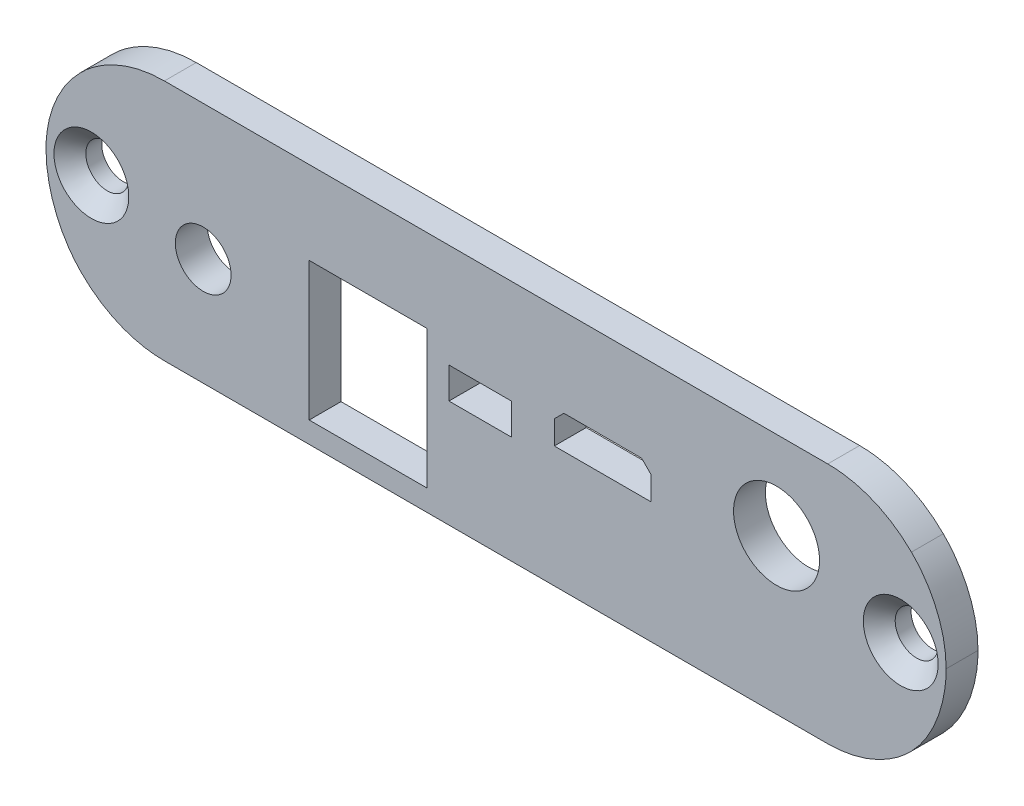
ISO-10303-21;
HEADER;
FILE_DESCRIPTION(('STEP AP214'),'2;1');
FILE_NAME('part.step','',(''),(''),'','','');
FILE_SCHEMA(('AUTOMOTIVE_DESIGN { 1 0 10303 214 1 1 1 1 }'));
ENDSEC;
DATA;
#1=APPLICATION_CONTEXT('core data for automotive mechanical design processes');
#2=APPLICATION_PROTOCOL_DEFINITION('international standard','automotive_design',2000,#1);
#3=PRODUCT_CONTEXT('',#1,'mechanical');
#4=PRODUCT('Part','Part','',(#3));
#5=PRODUCT_RELATED_PRODUCT_CATEGORY('part','',(#4));
#6=PRODUCT_DEFINITION_FORMATION('','',#4);
#7=PRODUCT_DEFINITION_CONTEXT('part definition',#1,'design');
#8=PRODUCT_DEFINITION('design','',#6,#7);
#9=PRODUCT_DEFINITION_SHAPE('','',#8);
#10=(LENGTH_UNIT() NAMED_UNIT(*) SI_UNIT(.MILLI.,.METRE.));
#11=(NAMED_UNIT(*) PLANE_ANGLE_UNIT() SI_UNIT($,.RADIAN.));
#12=(NAMED_UNIT(*) SI_UNIT($,.STERADIAN.) SOLID_ANGLE_UNIT());
#13=UNCERTAINTY_MEASURE_WITH_UNIT(LENGTH_MEASURE(1.E-05),#10,'distance_accuracy_value','');
#14=(GEOMETRIC_REPRESENTATION_CONTEXT(3) GLOBAL_UNCERTAINTY_ASSIGNED_CONTEXT((#13)) GLOBAL_UNIT_ASSIGNED_CONTEXT((#10,
#11,#12)) REPRESENTATION_CONTEXT('',''));
#15=CARTESIAN_POINT('',(0.,0.,0.));
#16=DIRECTION('',(0.,0.,1.));
#17=DIRECTION('',(1.,0.,0.));
#18=AXIS2_PLACEMENT_3D('',#15,#16,#17);
#19=CARTESIAN_POINT('',(15.1632625,-5.98045,2.54));
#20=DIRECTION('',(0.,0.,-1.));
#21=DIRECTION('',(-1.,0.,0.));
#22=AXIS2_PLACEMENT_3D('',#19,#20,#21);
#23=PLANE('',#22);
#24=CARTESIAN_POINT('',(12.2554,-2.1716,2.54));
#25=DIRECTION('',(0.,0.,-1.));
#26=DIRECTION('',(-1.,0.,0.));
#27=AXIS2_PLACEMENT_3D('',#24,#25,#26);
#28=CIRCLE('',#27,2.98440000000001);
#29=CARTESIAN_POINT('',(9.27099999999999,-2.1716,2.54));
#30=VERTEX_POINT('',#29);
#31=EDGE_CURVE('E41',#30,#30,#28,.T.);
#32=ORIENTED_EDGE('',*,*,#31,.T.);
#33=EDGE_LOOP('',(#32));
#34=FACE_BOUND('',#33,.T.);
#35=CARTESIAN_POINT('',(-52.2859,-2.1716,2.54));
#36=DIRECTION('',(0.,0.,-1.));
#37=DIRECTION('',(-1.,0.,0.));
#38=AXIS2_PLACEMENT_3D('',#35,#36,#37);
#39=CIRCLE('',#38,2.98440000000003);
#40=CARTESIAN_POINT('',(-55.2703,-2.1716,2.54));
#41=VERTEX_POINT('',#40);
#42=EDGE_CURVE('E484',#41,#41,#39,.T.);
#43=ORIENTED_EDGE('',*,*,#42,.T.);
#44=EDGE_LOOP('',(#43));
#45=FACE_BOUND('',#44,.T.);
#46=CARTESIAN_POINT('',(-43.3701,-3.5091,2.54));
#47=DIRECTION('',(0.,0.,1.));
#48=DIRECTION('',(1.,0.,0.));
#49=AXIS2_PLACEMENT_3D('',#46,#47,#48);
#50=CIRCLE('',#49,2.2226);
#51=CARTESIAN_POINT('',(-41.1475,-3.5091,2.54));
#52=VERTEX_POINT('',#51);
#53=EDGE_CURVE('E233',#52,#52,#50,.T.);
#54=ORIENTED_EDGE('',*,*,#53,.F.);
#55=EDGE_LOOP('',(#54));
#56=FACE_BOUND('',#55,.T.);
#57=CARTESIAN_POINT('',(2.35,0.250000000000001,2.54));
#58=DIRECTION('',(0.,0.,1.));
#59=DIRECTION('',(1.,0.,0.));
#60=AXIS2_PLACEMENT_3D('',#57,#58,#59);
#61=CIRCLE('',#60,3.4289);
#62=CARTESIAN_POINT('',(5.7789,0.250000000000001,2.54));
#63=VERTEX_POINT('',#62);
#64=EDGE_CURVE('E242',#63,#63,#61,.T.);
#65=ORIENTED_EDGE('',*,*,#64,.F.);
#66=EDGE_LOOP('',(#65));
#67=FACE_BOUND('',#66,.T.);
#68=DIRECTION('',(0.,-1.,0.));
#69=VECTOR('',#68,1.);
#70=CARTESIAN_POINT('',(-15.3715,-2.4124,2.54));
#71=LINE('',#70,#69);
#72=CARTESIAN_POINT('',(-15.3715,-0.5328,2.54));
#73=VERTEX_POINT('',#72);
#74=CARTESIAN_POINT('',(-15.3715,-2.4124,2.54));
#75=VERTEX_POINT('',#74);
#76=EDGE_CURVE('E248',#73,#75,#71,.T.);
#77=ORIENTED_EDGE('',*,*,#76,.F.);
#78=DIRECTION('',(-0.707106781186548,-0.707106781186547,0.));
#79=VECTOR('',#78,1.);
#80=CARTESIAN_POINT('',(-15.3715,-0.5328,2.54));
#81=LINE('',#80,#79);
#82=CARTESIAN_POINT('',(-14.6095,0.229199999999995,2.54));
#83=VERTEX_POINT('',#82);
#84=EDGE_CURVE('E260',#83,#73,#81,.T.);
#85=ORIENTED_EDGE('',*,*,#84,.F.);
#86=DIRECTION('',(-1.,0.,0.));
#87=VECTOR('',#86,1.);
#88=CARTESIAN_POINT('',(-14.6095,0.2292,2.54));
#89=LINE('',#88,#87);
#90=CARTESIAN_POINT('',(-8.4119,0.2292,2.54));
#91=VERTEX_POINT('',#90);
#92=EDGE_CURVE('E257',#91,#83,#89,.T.);
#93=ORIENTED_EDGE('',*,*,#92,.F.);
#94=DIRECTION('',(-0.707106781186548,0.707106781186547,0.));
#95=VECTOR('',#94,1.);
#96=CARTESIAN_POINT('',(-8.4119,0.2292,2.54));
#97=LINE('',#96,#95);
#98=CARTESIAN_POINT('',(-7.6499,-0.5328,2.54));
#99=VERTEX_POINT('',#98);
#100=EDGE_CURVE('E255',#99,#91,#97,.T.);
#101=ORIENTED_EDGE('',*,*,#100,.F.);
#102=DIRECTION('',(0.,1.,0.));
#103=VECTOR('',#102,1.);
#104=CARTESIAN_POINT('',(-7.6499,-2.4124,2.54));
#105=LINE('',#104,#103);
#106=CARTESIAN_POINT('',(-7.6499,-2.4124,2.54));
#107=VERTEX_POINT('',#106);
#108=EDGE_CURVE('E253',#107,#99,#105,.T.);
#109=ORIENTED_EDGE('',*,*,#108,.F.);
#110=DIRECTION('',(1.,0.,0.));
#111=VECTOR('',#110,1.);
#112=CARTESIAN_POINT('',(-15.3715,-2.4124,2.54));
#113=LINE('',#112,#111);
#114=EDGE_CURVE('E250',#75,#107,#113,.T.);
#115=ORIENTED_EDGE('',*,*,#114,.F.);
#116=EDGE_LOOP('',(#77,#85,#93,#101,#109,#115));
#117=FACE_BOUND('',#116,.T.);
#118=CARTESIAN_POINT('',(13.1151,-9.2429,2.54));
#119=CARTESIAN_POINT('',(14.8954,-7.4173,2.54));
#120=CARTESIAN_POINT('',(15.8766,-4.7239,2.54));
#121=CARTESIAN_POINT('',(15.875,-2.1771,2.54));
#122=B_SPLINE_CURVE_WITH_KNOTS('',3,(#118,#119,#120,#121),.UNSPECIFIED.,.F.,.F.,(4,4),(0.9,1.),.UNSPECIFIED.);
#123=CARTESIAN_POINT('',(13.1151,-9.2429,2.54));
#124=VERTEX_POINT('',#123);
#125=CARTESIAN_POINT('',(15.875,-2.1771,2.54));
#126=VERTEX_POINT('',#125);
#127=EDGE_CURVE('E324',#124,#126,#122,.T.);
#128=ORIENTED_EDGE('',*,*,#127,.T.);
#129=CARTESIAN_POINT('',(15.875,-2.1771,2.54));
#130=CARTESIAN_POINT('',(15.8735,0.322300000000001,2.54));
#131=CARTESIAN_POINT('',(14.8775,2.7305,2.54));
#132=CARTESIAN_POINT('',(13.1074,4.496,2.54));
#133=B_SPLINE_CURVE_WITH_KNOTS('',3,(#129,#130,#131,#132),.UNSPECIFIED.,.F.,.F.,(4,4),(0.,0.1),.UNSPECIFIED.);
#134=CARTESIAN_POINT('',(13.1074,4.496,2.54));
#135=VERTEX_POINT('',#134);
#136=EDGE_CURVE('E330',#126,#135,#133,.T.);
#137=ORIENTED_EDGE('',*,*,#136,.T.);
#138=CARTESIAN_POINT('',(13.1074,4.496,2.54));
#139=CARTESIAN_POINT('',(11.3364,6.2625,2.54));
#140=CARTESIAN_POINT('',(8.9354,7.2533,2.54));
#141=CARTESIAN_POINT('',(6.434,7.2517,2.54));
#142=B_SPLINE_CURVE_WITH_KNOTS('',3,(#138,#139,#140,#141),.UNSPECIFIED.,.F.,.F.,(4,4),(0.1,0.2),.UNSPECIFIED.);
#143=CARTESIAN_POINT('',(6.434,7.2517,2.54));
#144=VERTEX_POINT('',#143);
#145=EDGE_CURVE('E599',#135,#144,#142,.T.);
#146=ORIENTED_EDGE('',*,*,#145,.T.);
#147=DIRECTION('',(-1.,0.,0.));
#148=VECTOR('',#147,1.);
#149=CARTESIAN_POINT('',(6.434,7.2517,2.54));
#150=LINE('',#149,#148);
#151=CARTESIAN_POINT('',(-46.4644,7.2517,2.54));
#152=VERTEX_POINT('',#151);
#153=EDGE_CURVE('E600',#144,#152,#150,.T.);
#154=ORIENTED_EDGE('',*,*,#153,.T.);
#155=CARTESIAN_POINT('',(-46.4644,7.2517,2.54));
#156=CARTESIAN_POINT('',(-48.9654,7.2501,2.54));
#157=CARTESIAN_POINT('',(-51.3771,6.2567,2.54));
#158=CARTESIAN_POINT('',(-53.1462,4.4876,2.54));
#159=B_SPLINE_CURVE_WITH_KNOTS('',3,(#155,#156,#157,#158),.UNSPECIFIED.,.F.,.F.,(4,4),(0.3,0.4),.UNSPECIFIED.);
#160=CARTESIAN_POINT('',(-53.1462,4.4876,2.54));
#161=VERTEX_POINT('',#160);
#162=EDGE_CURVE('E602',#152,#161,#159,.T.);
#163=ORIENTED_EDGE('',*,*,#162,.T.);
#164=CARTESIAN_POINT('',(-53.1462,4.4876,2.54));
#165=CARTESIAN_POINT('',(-54.9139,2.7201,2.54));
#166=CARTESIAN_POINT('',(-55.907,0.322799999999999,2.54));
#167=CARTESIAN_POINT('',(-55.9054,-2.1769,2.54));
#168=B_SPLINE_CURVE_WITH_KNOTS('',3,(#164,#165,#166,#167),.UNSPECIFIED.,.F.,.F.,(4,4),(0.4,0.5),.UNSPECIFIED.);
#169=CARTESIAN_POINT('',(-55.9054,-2.1769,2.54));
#170=VERTEX_POINT('',#169);
#171=EDGE_CURVE('E629',#161,#170,#168,.T.);
#172=ORIENTED_EDGE('',*,*,#171,.T.);
#173=CARTESIAN_POINT('',(-55.9054,-2.1769,2.54));
#174=CARTESIAN_POINT('',(-55.9039,-4.7242,2.54));
#175=CARTESIAN_POINT('',(-54.9188,-7.4291,2.54));
#176=CARTESIAN_POINT('',(-53.137,-9.2518,2.54));
#177=B_SPLINE_CURVE_WITH_KNOTS('',3,(#173,#174,#175,#176),.UNSPECIFIED.,.F.,.F.,(4,4),(0.5,0.6),.UNSPECIFIED.);
#178=CARTESIAN_POINT('',(-53.137,-9.2518,2.54));
#179=VERTEX_POINT('',#178);
#180=EDGE_CURVE('E637',#170,#179,#177,.T.);
#181=ORIENTED_EDGE('',*,*,#180,.T.);
#182=CARTESIAN_POINT('',(-53.137,-9.2518,2.54));
#183=CARTESIAN_POINT('',(-51.3786,-11.0507,2.54));
#184=CARTESIAN_POINT('',(-48.9824,-12.0793,2.54));
#185=CARTESIAN_POINT('',(-46.4644,-12.0777,2.54));
#186=B_SPLINE_CURVE_WITH_KNOTS('',3,(#182,#183,#184,#185),.UNSPECIFIED.,.F.,.F.,(4,4),(0.6,0.7),.UNSPECIFIED.);
#187=CARTESIAN_POINT('',(-46.4644,-12.0777,2.54));
#188=VERTEX_POINT('',#187);
#189=EDGE_CURVE('E644',#179,#188,#186,.T.);
#190=ORIENTED_EDGE('',*,*,#189,.T.);
#191=DIRECTION('',(1.,0.,0.));
#192=VECTOR('',#191,1.);
#193=CARTESIAN_POINT('',(-46.4644,-12.0777,2.54));
#194=LINE('',#193,#192);
#195=CARTESIAN_POINT('',(6.434,-12.0777,2.54));
#196=VERTEX_POINT('',#195);
#197=EDGE_CURVE('E388',#188,#196,#194,.T.);
#198=ORIENTED_EDGE('',*,*,#197,.T.);
#199=CARTESIAN_POINT('',(6.434,-12.0777,2.54));
#200=CARTESIAN_POINT('',(8.9516,-12.0761,2.54));
#201=CARTESIAN_POINT('',(11.3581,-11.0449,2.54));
#202=CARTESIAN_POINT('',(13.1151,-9.2429,2.54));
#203=B_SPLINE_CURVE_WITH_KNOTS('',3,(#199,#200,#201,#202),.UNSPECIFIED.,.F.,.F.,(4,4),(0.8,0.9),.UNSPECIFIED.);
#204=EDGE_CURVE('E381',#196,#124,#203,.T.);
#205=ORIENTED_EDGE('',*,*,#204,.T.);
#206=EDGE_LOOP('',(#128,#137,#146,#154,#163,#172,#181,#190,#198,#205));
#207=FACE_BOUND('',#206,.T.);
#208=DIRECTION('',(0.,1.,0.));
#209=VECTOR('',#208,1.);
#210=CARTESIAN_POINT('',(-25.5201,0.631000000000001,2.54));
#211=LINE('',#210,#209);
#212=CARTESIAN_POINT('',(-25.5201,-10.3925,2.54));
#213=VERTEX_POINT('',#212);
#214=CARTESIAN_POINT('',(-25.5201,0.631000000000001,2.54));
#215=VERTEX_POINT('',#214);
#216=EDGE_CURVE('E293',#213,#215,#211,.T.);
#217=ORIENTED_EDGE('',*,*,#216,.F.);
#218=DIRECTION('',(1.,0.,0.));
#219=VECTOR('',#218,1.);
#220=CARTESIAN_POINT('',(-34.9181,-10.3925,2.54));
#221=LINE('',#220,#219);
#222=CARTESIAN_POINT('',(-34.9181,-10.3925,2.54));
#223=VERTEX_POINT('',#222);
#224=EDGE_CURVE('E301',#223,#213,#221,.T.);
#225=ORIENTED_EDGE('',*,*,#224,.F.);
#226=DIRECTION('',(0.,-1.,0.));
#227=VECTOR('',#226,1.);
#228=CARTESIAN_POINT('',(-34.9181,0.631000000000001,2.54));
#229=LINE('',#228,#227);
#230=CARTESIAN_POINT('',(-34.9181,0.631000000000001,2.54));
#231=VERTEX_POINT('',#230);
#232=EDGE_CURVE('E298',#231,#223,#229,.T.);
#233=ORIENTED_EDGE('',*,*,#232,.F.);
#234=DIRECTION('',(-1.,0.,0.));
#235=VECTOR('',#234,1.);
#236=CARTESIAN_POINT('',(-34.9181,0.631000000000001,2.54));
#237=LINE('',#236,#235);
#238=EDGE_CURVE('E295',#215,#231,#237,.T.);
#239=ORIENTED_EDGE('',*,*,#238,.F.);
#240=EDGE_LOOP('',(#217,#225,#233,#239));
#241=FACE_BOUND('',#240,.T.);
#242=DIRECTION('',(0.,1.,0.));
#243=VECTOR('',#242,1.);
#244=CARTESIAN_POINT('',(-18.7701,-1.0201,2.54));
#245=LINE('',#244,#243);
#246=CARTESIAN_POINT('',(-18.7701,-3.5092,2.54));
#247=VERTEX_POINT('',#246);
#248=CARTESIAN_POINT('',(-18.7701,-1.0201,2.54));
#249=VERTEX_POINT('',#248);
#250=EDGE_CURVE('E194',#247,#249,#245,.T.);
#251=ORIENTED_EDGE('',*,*,#250,.F.);
#252=DIRECTION('',(1.,0.,0.));
#253=VECTOR('',#252,1.);
#254=CARTESIAN_POINT('',(-23.7738,-3.5092,2.54));
#255=LINE('',#254,#253);
#256=CARTESIAN_POINT('',(-23.7738,-3.5092,2.54));
#257=VERTEX_POINT('',#256);
#258=EDGE_CURVE('E216',#257,#247,#255,.T.);
#259=ORIENTED_EDGE('',*,*,#258,.F.);
#260=DIRECTION('',(0.,-1.,0.));
#261=VECTOR('',#260,1.);
#262=CARTESIAN_POINT('',(-23.7738,-1.0201,2.54));
#263=LINE('',#262,#261);
#264=CARTESIAN_POINT('',(-23.7738,-1.0201,2.54));
#265=VERTEX_POINT('',#264);
#266=EDGE_CURVE('E214',#265,#257,#263,.T.);
#267=ORIENTED_EDGE('',*,*,#266,.F.);
#268=DIRECTION('',(-1.,0.,0.));
#269=VECTOR('',#268,1.);
#270=CARTESIAN_POINT('',(-23.7738,-1.0201,2.54));
#271=LINE('',#270,#269);
#272=EDGE_CURVE('E202',#249,#265,#271,.T.);
#273=ORIENTED_EDGE('',*,*,#272,.F.);
#274=EDGE_LOOP('',(#251,#259,#267,#273));
#275=FACE_BOUND('',#274,.T.);
#276=ADVANCED_FACE('F33',(#34,#45,#56,#67,#117,#207,#241,#275),#23,.F.);
#277=CARTESIAN_POINT('',(15.1632625,-5.98045,0.));
#278=DIRECTION('',(0.,0.,-1.));
#279=DIRECTION('',(-1.,0.,0.));
#280=AXIS2_PLACEMENT_3D('',#277,#278,#279);
#281=PLANE('',#280);
#282=CARTESIAN_POINT('',(-43.3701,-3.5091,0.));
#283=DIRECTION('',(0.,0.,1.));
#284=DIRECTION('',(1.,0.,0.));
#285=AXIS2_PLACEMENT_3D('',#282,#283,#284);
#286=CIRCLE('',#285,2.2226);
#287=CARTESIAN_POINT('',(-41.1475,-3.5091,0.));
#288=VERTEX_POINT('',#287);
#289=EDGE_CURVE('E232',#288,#288,#286,.T.);
#290=ORIENTED_EDGE('',*,*,#289,.T.);
#291=EDGE_LOOP('',(#290));
#292=FACE_BOUND('',#291,.T.);
#293=CARTESIAN_POINT('',(2.35,0.250000000000001,0.));
#294=DIRECTION('',(0.,0.,1.));
#295=DIRECTION('',(1.,0.,0.));
#296=AXIS2_PLACEMENT_3D('',#293,#294,#295);
#297=CIRCLE('',#296,3.4289);
#298=CARTESIAN_POINT('',(5.7789,0.250000000000001,0.));
#299=VERTEX_POINT('',#298);
#300=EDGE_CURVE('E241',#299,#299,#297,.T.);
#301=ORIENTED_EDGE('',*,*,#300,.T.);
#302=EDGE_LOOP('',(#301));
#303=FACE_BOUND('',#302,.T.);
#304=CARTESIAN_POINT('',(13.1151,-9.2429,0.));
#305=CARTESIAN_POINT('',(14.8954,-7.4173,0.));
#306=CARTESIAN_POINT('',(15.8766,-4.7239,0.));
#307=CARTESIAN_POINT('',(15.875,-2.1771,0.));
#308=B_SPLINE_CURVE_WITH_KNOTS('',3,(#304,#305,#306,#307),.UNSPECIFIED.,.F.,.F.,(4,4),(0.9,1.),.UNSPECIFIED.);
#309=CARTESIAN_POINT('',(13.1151,-9.2429,0.));
#310=VERTEX_POINT('',#309);
#311=CARTESIAN_POINT('',(15.875,-2.1771,0.));
#312=VERTEX_POINT('',#311);
#313=EDGE_CURVE('E323',#310,#312,#308,.T.);
#314=ORIENTED_EDGE('',*,*,#313,.F.);
#315=CARTESIAN_POINT('',(6.434,-12.0777,0.));
#316=CARTESIAN_POINT('',(8.9516,-12.0761,0.));
#317=CARTESIAN_POINT('',(11.3581,-11.0449,0.));
#318=CARTESIAN_POINT('',(13.1151,-9.2429,0.));
#319=B_SPLINE_CURVE_WITH_KNOTS('',3,(#315,#316,#317,#318),.UNSPECIFIED.,.F.,.F.,(4,4),(0.8,0.9),.UNSPECIFIED.);
#320=CARTESIAN_POINT('',(6.434,-12.0777,0.));
#321=VERTEX_POINT('',#320);
#322=EDGE_CURVE('E331',#321,#310,#319,.T.);
#323=ORIENTED_EDGE('',*,*,#322,.F.);
#324=DIRECTION('',(1.,0.,0.));
#325=VECTOR('',#324,1.);
#326=CARTESIAN_POINT('',(-46.4644,-12.0777,0.));
#327=LINE('',#326,#325);
#328=CARTESIAN_POINT('',(-46.4644,-12.0777,0.));
#329=VERTEX_POINT('',#328);
#330=EDGE_CURVE('E441',#329,#321,#327,.T.);
#331=ORIENTED_EDGE('',*,*,#330,.F.);
#332=CARTESIAN_POINT('',(-53.137,-9.2518,0.));
#333=CARTESIAN_POINT('',(-51.3786,-11.0507,0.));
#334=CARTESIAN_POINT('',(-48.9824,-12.0793,0.));
#335=CARTESIAN_POINT('',(-46.4644,-12.0777,0.));
#336=B_SPLINE_CURVE_WITH_KNOTS('',3,(#332,#333,#334,#335),.UNSPECIFIED.,.F.,.F.,(4,4),(0.6,0.7),.UNSPECIFIED.);
#337=CARTESIAN_POINT('',(-53.137,-9.2518,0.));
#338=VERTEX_POINT('',#337);
#339=EDGE_CURVE('E434',#338,#329,#336,.T.);
#340=ORIENTED_EDGE('',*,*,#339,.F.);
#341=CARTESIAN_POINT('',(-55.9054,-2.1769,0.));
#342=CARTESIAN_POINT('',(-55.9039,-4.7242,0.));
#343=CARTESIAN_POINT('',(-54.9188,-7.4291,0.));
#344=CARTESIAN_POINT('',(-53.137,-9.2518,0.));
#345=B_SPLINE_CURVE_WITH_KNOTS('',3,(#341,#342,#343,#344),.UNSPECIFIED.,.F.,.F.,(4,4),(0.5,0.6),.UNSPECIFIED.);
#346=CARTESIAN_POINT('',(-55.9054,-2.1769,0.));
#347=VERTEX_POINT('',#346);
#348=EDGE_CURVE('E427',#347,#338,#345,.T.);
#349=ORIENTED_EDGE('',*,*,#348,.F.);
#350=CARTESIAN_POINT('',(-53.1462,4.4876,0.));
#351=CARTESIAN_POINT('',(-54.9139,2.7201,0.));
#352=CARTESIAN_POINT('',(-55.907,0.322799999999999,0.));
#353=CARTESIAN_POINT('',(-55.9054,-2.1769,0.));
#354=B_SPLINE_CURVE_WITH_KNOTS('',3,(#350,#351,#352,#353),.UNSPECIFIED.,.F.,.F.,(4,4),(0.4,0.5),.UNSPECIFIED.);
#355=CARTESIAN_POINT('',(-53.1462,4.4876,0.));
#356=VERTEX_POINT('',#355);
#357=EDGE_CURVE('E420',#356,#347,#354,.T.);
#358=ORIENTED_EDGE('',*,*,#357,.F.);
#359=CARTESIAN_POINT('',(-46.4644,7.2517,0.));
#360=CARTESIAN_POINT('',(-48.9654,7.2501,0.));
#361=CARTESIAN_POINT('',(-51.3771,6.2567,0.));
#362=CARTESIAN_POINT('',(-53.1462,4.4876,0.));
#363=B_SPLINE_CURVE_WITH_KNOTS('',3,(#359,#360,#361,#362),.UNSPECIFIED.,.F.,.F.,(4,4),(0.3,0.4),.UNSPECIFIED.);
#364=CARTESIAN_POINT('',(-46.4644,7.2517,0.));
#365=VERTEX_POINT('',#364);
#366=EDGE_CURVE('E416',#365,#356,#363,.T.);
#367=ORIENTED_EDGE('',*,*,#366,.F.);
#368=DIRECTION('',(-1.,0.,0.));
#369=VECTOR('',#368,1.);
#370=CARTESIAN_POINT('',(6.434,7.2517,0.));
#371=LINE('',#370,#369);
#372=CARTESIAN_POINT('',(6.434,7.2517,0.));
#373=VERTEX_POINT('',#372);
#374=EDGE_CURVE('E411',#373,#365,#371,.T.);
#375=ORIENTED_EDGE('',*,*,#374,.F.);
#376=CARTESIAN_POINT('',(13.1074,4.496,0.));
#377=CARTESIAN_POINT('',(11.3364,6.2625,0.));
#378=CARTESIAN_POINT('',(8.9354,7.2533,0.));
#379=CARTESIAN_POINT('',(6.434,7.2517,0.));
#380=B_SPLINE_CURVE_WITH_KNOTS('',3,(#376,#377,#378,#379),.UNSPECIFIED.,.F.,.F.,(4,4),(0.1,0.2),.UNSPECIFIED.);
#381=CARTESIAN_POINT('',(13.1074,4.496,0.));
#382=VERTEX_POINT('',#381);
#383=EDGE_CURVE('E404',#382,#373,#380,.T.);
#384=ORIENTED_EDGE('',*,*,#383,.F.);
#385=CARTESIAN_POINT('',(15.875,-2.1771,0.));
#386=CARTESIAN_POINT('',(15.8735,0.322300000000001,0.));
#387=CARTESIAN_POINT('',(14.8775,2.7305,0.));
#388=CARTESIAN_POINT('',(13.1074,4.496,0.));
#389=B_SPLINE_CURVE_WITH_KNOTS('',3,(#385,#386,#387,#388),.UNSPECIFIED.,.F.,.F.,(4,4),(0.,0.1),.UNSPECIFIED.);
#390=EDGE_CURVE('E397',#312,#382,#389,.T.);
#391=ORIENTED_EDGE('',*,*,#390,.F.);
#392=EDGE_LOOP('',(#314,#323,#331,#340,#349,#358,#367,#375,#384,#391));
#393=FACE_BOUND('',#392,.T.);
#394=DIRECTION('',(1.,0.,0.));
#395=VECTOR('',#394,1.);
#396=CARTESIAN_POINT('',(-34.9181,-10.3925,0.));
#397=LINE('',#396,#395);
#398=CARTESIAN_POINT('',(-34.9181,-10.3925,0.));
#399=VERTEX_POINT('',#398);
#400=CARTESIAN_POINT('',(-25.5201,-10.3925,0.));
#401=VERTEX_POINT('',#400);
#402=EDGE_CURVE('E296',#399,#401,#397,.T.);
#403=ORIENTED_EDGE('',*,*,#402,.T.);
#404=DIRECTION('',(0.,1.,0.));
#405=VECTOR('',#404,1.);
#406=CARTESIAN_POINT('',(-25.5201,0.631000000000001,0.));
#407=LINE('',#406,#405);
#408=CARTESIAN_POINT('',(-25.5201,0.631000000000001,0.));
#409=VERTEX_POINT('',#408);
#410=EDGE_CURVE('E292',#401,#409,#407,.T.);
#411=ORIENTED_EDGE('',*,*,#410,.T.);
#412=DIRECTION('',(-1.,0.,0.));
#413=VECTOR('',#412,1.);
#414=CARTESIAN_POINT('',(-34.9181,0.631000000000001,0.));
#415=LINE('',#414,#413);
#416=CARTESIAN_POINT('',(-34.9181,0.631000000000001,0.));
#417=VERTEX_POINT('',#416);
#418=EDGE_CURVE('E306',#409,#417,#415,.T.);
#419=ORIENTED_EDGE('',*,*,#418,.T.);
#420=DIRECTION('',(0.,-1.,0.));
#421=VECTOR('',#420,1.);
#422=CARTESIAN_POINT('',(-34.9181,0.631000000000001,0.));
#423=LINE('',#422,#421);
#424=EDGE_CURVE('E309',#417,#399,#423,.T.);
#425=ORIENTED_EDGE('',*,*,#424,.T.);
#426=EDGE_LOOP('',(#403,#411,#419,#425));
#427=FACE_BOUND('',#426,.T.);
#428=DIRECTION('',(-0.707106781186548,-0.707106781186547,0.));
#429=VECTOR('',#428,1.);
#430=CARTESIAN_POINT('',(-15.3715,-0.5328,0.));
#431=LINE('',#430,#429);
#432=CARTESIAN_POINT('',(-14.6095,0.2292,0.));
#433=VERTEX_POINT('',#432);
#434=CARTESIAN_POINT('',(-15.3715,-0.5328,0.));
#435=VERTEX_POINT('',#434);
#436=EDGE_CURVE('E251',#433,#435,#431,.T.);
#437=ORIENTED_EDGE('',*,*,#436,.T.);
#438=DIRECTION('',(0.,-1.,0.));
#439=VECTOR('',#438,1.);
#440=CARTESIAN_POINT('',(-15.3715,-2.4124,0.));
#441=LINE('',#440,#439);
#442=CARTESIAN_POINT('',(-15.3715,-2.4124,0.));
#443=VERTEX_POINT('',#442);
#444=EDGE_CURVE('E245',#435,#443,#441,.T.);
#445=ORIENTED_EDGE('',*,*,#444,.T.);
#446=DIRECTION('',(1.,0.,0.));
#447=VECTOR('',#446,1.);
#448=CARTESIAN_POINT('',(-15.3715,-2.4124,0.));
#449=LINE('',#448,#447);
#450=CARTESIAN_POINT('',(-7.6499,-2.4124,0.));
#451=VERTEX_POINT('',#450);
#452=EDGE_CURVE('E265',#443,#451,#449,.T.);
#453=ORIENTED_EDGE('',*,*,#452,.T.);
#454=DIRECTION('',(0.,1.,0.));
#455=VECTOR('',#454,1.);
#456=CARTESIAN_POINT('',(-7.6499,-2.4124,0.));
#457=LINE('',#456,#455);
#458=CARTESIAN_POINT('',(-7.6499,-0.5328,0.));
#459=VERTEX_POINT('',#458);
#460=EDGE_CURVE('E268',#451,#459,#457,.T.);
#461=ORIENTED_EDGE('',*,*,#460,.T.);
#462=DIRECTION('',(-0.707106781186548,0.707106781186547,0.));
#463=VECTOR('',#462,1.);
#464=CARTESIAN_POINT('',(-8.4119,0.2292,0.));
#465=LINE('',#464,#463);
#466=CARTESIAN_POINT('',(-8.4119,0.2292,0.));
#467=VERTEX_POINT('',#466);
#468=EDGE_CURVE('E271',#459,#467,#465,.T.);
#469=ORIENTED_EDGE('',*,*,#468,.T.);
#470=DIRECTION('',(-1.,0.,0.));
#471=VECTOR('',#470,1.);
#472=CARTESIAN_POINT('',(-14.6095,0.2292,0.));
#473=LINE('',#472,#471);
#474=EDGE_CURVE('E274',#467,#433,#473,.T.);
#475=ORIENTED_EDGE('',*,*,#474,.T.);
#476=EDGE_LOOP('',(#437,#445,#453,#461,#469,#475));
#477=FACE_BOUND('',#476,.T.);
#478=CARTESIAN_POINT('',(12.2554,-2.1716,0.));
#479=DIRECTION('',(0.,0.,1.));
#480=DIRECTION('',(1.,0.,0.));
#481=AXIS2_PLACEMENT_3D('',#478,#479,#480);
#482=CIRCLE('',#481,1.7144);
#483=CARTESIAN_POINT('',(13.9698,-2.1716,0.));
#484=VERTEX_POINT('',#483);
#485=EDGE_CURVE('E236',#484,#484,#482,.T.);
#486=ORIENTED_EDGE('',*,*,#485,.T.);
#487=EDGE_LOOP('',(#486));
#488=FACE_BOUND('',#487,.T.);
#489=CARTESIAN_POINT('',(-52.2859,-2.1716,0.));
#490=DIRECTION('',(0.,0.,1.));
#491=DIRECTION('',(1.,0.,0.));
#492=AXIS2_PLACEMENT_3D('',#489,#490,#491);
#493=CIRCLE('',#492,1.7144);
#494=CARTESIAN_POINT('',(-50.5715,-2.1716,0.));
#495=VERTEX_POINT('',#494);
#496=EDGE_CURVE('E210',#495,#495,#493,.T.);
#497=ORIENTED_EDGE('',*,*,#496,.T.);
#498=EDGE_LOOP('',(#497));
#499=FACE_BOUND('',#498,.T.);
#500=DIRECTION('',(1.,0.,0.));
#501=VECTOR('',#500,1.);
#502=CARTESIAN_POINT('',(-23.7738,-3.5092,0.));
#503=LINE('',#502,#501);
#504=CARTESIAN_POINT('',(-23.7738,-3.5092,0.));
#505=VERTEX_POINT('',#504);
#506=CARTESIAN_POINT('',(-18.7701,-3.5092,0.));
#507=VERTEX_POINT('',#506);
#508=EDGE_CURVE('E203',#505,#507,#503,.T.);
#509=ORIENTED_EDGE('',*,*,#508,.T.);
#510=DIRECTION('',(0.,1.,0.));
#511=VECTOR('',#510,1.);
#512=CARTESIAN_POINT('',(-18.7701,-1.0201,0.));
#513=LINE('',#512,#511);
#514=CARTESIAN_POINT('',(-18.7701,-1.0201,0.));
#515=VERTEX_POINT('',#514);
#516=EDGE_CURVE('E56',#507,#515,#513,.T.);
#517=ORIENTED_EDGE('',*,*,#516,.T.);
#518=DIRECTION('',(-1.,0.,0.));
#519=VECTOR('',#518,1.);
#520=CARTESIAN_POINT('',(-23.7738,-1.0201,0.));
#521=LINE('',#520,#519);
#522=CARTESIAN_POINT('',(-23.7738,-1.0201,0.));
#523=VERTEX_POINT('',#522);
#524=EDGE_CURVE('E209',#515,#523,#521,.T.);
#525=ORIENTED_EDGE('',*,*,#524,.T.);
#526=DIRECTION('',(0.,-1.,0.));
#527=VECTOR('',#526,1.);
#528=CARTESIAN_POINT('',(-23.7738,-1.0201,0.));
#529=LINE('',#528,#527);
#530=EDGE_CURVE('E222',#523,#505,#529,.T.);
#531=ORIENTED_EDGE('',*,*,#530,.T.);
#532=EDGE_LOOP('',(#509,#517,#525,#531));
#533=FACE_BOUND('',#532,.T.);
#534=ADVANCED_FACE('F344',(#292,#303,#393,#427,#477,#488,#499,#533),#281,.T.);
#535=DIRECTION('',(0.,0.,-1.));
#536=VECTOR('',#535,1.);
#537=SURFACE_OF_LINEAR_EXTRUSION('',#122,#536);
#538=ORIENTED_EDGE('',*,*,#313,.T.);
#539=DIRECTION('',(0.,0.,-1.));
#540=VECTOR('',#539,1.);
#541=CARTESIAN_POINT('',(15.875,-2.1771,2.54));
#542=LINE('',#541,#540);
#543=EDGE_CURVE('E478',#126,#312,#542,.T.);
#544=ORIENTED_EDGE('',*,*,#543,.F.);
#545=ORIENTED_EDGE('',*,*,#127,.F.);
#546=DIRECTION('',(0.,0.,-1.));
#547=VECTOR('',#546,1.);
#548=CARTESIAN_POINT('',(13.1151,-9.2429,2.54));
#549=LINE('',#548,#547);
#550=EDGE_CURVE('E387',#124,#310,#549,.T.);
#551=ORIENTED_EDGE('',*,*,#550,.T.);
#552=EDGE_LOOP('',(#538,#544,#545,#551));
#553=FACE_BOUND('',#552,.T.);
#554=ADVANCED_FACE('F340',(#553),#537,.F.);
#555=DIRECTION('',(0.,0.,-1.));
#556=VECTOR('',#555,1.);
#557=SURFACE_OF_LINEAR_EXTRUSION('',#133,#556);
#558=ORIENTED_EDGE('',*,*,#390,.T.);
#559=DIRECTION('',(0.,0.,-1.));
#560=VECTOR('',#559,1.);
#561=CARTESIAN_POINT('',(13.1074,4.496,2.54));
#562=LINE('',#561,#560);
#563=EDGE_CURVE('E475',#135,#382,#562,.T.);
#564=ORIENTED_EDGE('',*,*,#563,.F.);
#565=ORIENTED_EDGE('',*,*,#136,.F.);
#566=ORIENTED_EDGE('',*,*,#543,.T.);
#567=EDGE_LOOP('',(#558,#564,#565,#566));
#568=FACE_BOUND('',#567,.T.);
#569=ADVANCED_FACE('F343',(#568),#557,.F.);
#570=DIRECTION('',(0.,0.,-1.));
#571=VECTOR('',#570,1.);
#572=SURFACE_OF_LINEAR_EXTRUSION('',#142,#571);
#573=ORIENTED_EDGE('',*,*,#383,.T.);
#574=DIRECTION('',(0.,0.,-1.));
#575=VECTOR('',#574,1.);
#576=CARTESIAN_POINT('',(6.434,7.2517,2.54));
#577=LINE('',#576,#575);
#578=EDGE_CURVE('E472',#144,#373,#577,.T.);
#579=ORIENTED_EDGE('',*,*,#578,.F.);
#580=ORIENTED_EDGE('',*,*,#145,.F.);
#581=ORIENTED_EDGE('',*,*,#563,.T.);
#582=EDGE_LOOP('',(#573,#579,#580,#581));
#583=FACE_BOUND('',#582,.T.);
#584=ADVANCED_FACE('F611',(#583),#572,.F.);
#585=CARTESIAN_POINT('',(6.434,7.2517,2.54));
#586=DIRECTION('',(0.,-1.,0.));
#587=DIRECTION('',(0.,0.,-1.));
#588=AXIS2_PLACEMENT_3D('',#585,#586,#587);
#589=PLANE('',#588);
#590=ORIENTED_EDGE('',*,*,#374,.T.);
#591=DIRECTION('',(0.,0.,-1.));
#592=VECTOR('',#591,1.);
#593=CARTESIAN_POINT('',(-46.4644,7.2517,2.54));
#594=LINE('',#593,#592);
#595=EDGE_CURVE('E469',#152,#365,#594,.T.);
#596=ORIENTED_EDGE('',*,*,#595,.F.);
#597=ORIENTED_EDGE('',*,*,#153,.F.);
#598=ORIENTED_EDGE('',*,*,#578,.T.);
#599=EDGE_LOOP('',(#590,#596,#597,#598));
#600=FACE_BOUND('',#599,.T.);
#601=ADVANCED_FACE('F614',(#600),#589,.F.);
#602=DIRECTION('',(0.,0.,-1.));
#603=VECTOR('',#602,1.);
#604=SURFACE_OF_LINEAR_EXTRUSION('',#159,#603);
#605=ORIENTED_EDGE('',*,*,#366,.T.);
#606=DIRECTION('',(0.,0.,-1.));
#607=VECTOR('',#606,1.);
#608=CARTESIAN_POINT('',(-53.1462,4.4876,2.54));
#609=LINE('',#608,#607);
#610=EDGE_CURVE('E466',#161,#356,#609,.T.);
#611=ORIENTED_EDGE('',*,*,#610,.F.);
#612=ORIENTED_EDGE('',*,*,#162,.F.);
#613=ORIENTED_EDGE('',*,*,#595,.T.);
#614=EDGE_LOOP('',(#605,#611,#612,#613));
#615=FACE_BOUND('',#614,.T.);
#616=ADVANCED_FACE('F618',(#615),#604,.F.);
#617=DIRECTION('',(0.,0.,-1.));
#618=VECTOR('',#617,1.);
#619=SURFACE_OF_LINEAR_EXTRUSION('',#168,#618);
#620=ORIENTED_EDGE('',*,*,#357,.T.);
#621=DIRECTION('',(0.,0.,-1.));
#622=VECTOR('',#621,1.);
#623=CARTESIAN_POINT('',(-55.9054,-2.1769,2.54));
#624=LINE('',#623,#622);
#625=EDGE_CURVE('E463',#170,#347,#624,.T.);
#626=ORIENTED_EDGE('',*,*,#625,.F.);
#627=ORIENTED_EDGE('',*,*,#171,.F.);
#628=ORIENTED_EDGE('',*,*,#610,.T.);
#629=EDGE_LOOP('',(#620,#626,#627,#628));
#630=FACE_BOUND('',#629,.T.);
#631=ADVANCED_FACE('F622',(#630),#619,.F.);
#632=DIRECTION('',(0.,0.,-1.));
#633=VECTOR('',#632,1.);
#634=SURFACE_OF_LINEAR_EXTRUSION('',#177,#633);
#635=ORIENTED_EDGE('',*,*,#348,.T.);
#636=DIRECTION('',(0.,0.,-1.));
#637=VECTOR('',#636,1.);
#638=CARTESIAN_POINT('',(-53.137,-9.2518,2.54));
#639=LINE('',#638,#637);
#640=EDGE_CURVE('E460',#179,#338,#639,.T.);
#641=ORIENTED_EDGE('',*,*,#640,.F.);
#642=ORIENTED_EDGE('',*,*,#180,.F.);
#643=ORIENTED_EDGE('',*,*,#625,.T.);
#644=EDGE_LOOP('',(#635,#641,#642,#643));
#645=FACE_BOUND('',#644,.T.);
#646=ADVANCED_FACE('F651',(#645),#634,.F.);
#647=DIRECTION('',(0.,0.,-1.));
#648=VECTOR('',#647,1.);
#649=SURFACE_OF_LINEAR_EXTRUSION('',#186,#648);
#650=ORIENTED_EDGE('',*,*,#339,.T.);
#651=DIRECTION('',(0.,0.,-1.));
#652=VECTOR('',#651,1.);
#653=CARTESIAN_POINT('',(-46.4644,-12.0777,2.54));
#654=LINE('',#653,#652);
#655=EDGE_CURVE('E457',#188,#329,#654,.T.);
#656=ORIENTED_EDGE('',*,*,#655,.F.);
#657=ORIENTED_EDGE('',*,*,#189,.F.);
#658=ORIENTED_EDGE('',*,*,#640,.T.);
#659=EDGE_LOOP('',(#650,#656,#657,#658));
#660=FACE_BOUND('',#659,.T.);
#661=ADVANCED_FACE('F653',(#660),#649,.F.);
#662=CARTESIAN_POINT('',(-46.4644,-12.0777,2.54));
#663=DIRECTION('',(0.,1.,0.));
#664=DIRECTION('',(0.,0.,1.));
#665=AXIS2_PLACEMENT_3D('',#662,#663,#664);
#666=PLANE('',#665);
#667=ORIENTED_EDGE('',*,*,#330,.T.);
#668=DIRECTION('',(0.,0.,-1.));
#669=VECTOR('',#668,1.);
#670=CARTESIAN_POINT('',(6.434,-12.0777,2.54));
#671=LINE('',#670,#669);
#672=EDGE_CURVE('E454',#196,#321,#671,.T.);
#673=ORIENTED_EDGE('',*,*,#672,.F.);
#674=ORIENTED_EDGE('',*,*,#197,.F.);
#675=ORIENTED_EDGE('',*,*,#655,.T.);
#676=EDGE_LOOP('',(#667,#673,#674,#675));
#677=FACE_BOUND('',#676,.T.);
#678=ADVANCED_FACE('F378',(#677),#666,.F.);
#679=DIRECTION('',(0.,0.,-1.));
#680=VECTOR('',#679,1.);
#681=SURFACE_OF_LINEAR_EXTRUSION('',#203,#680);
#682=ORIENTED_EDGE('',*,*,#322,.T.);
#683=ORIENTED_EDGE('',*,*,#550,.F.);
#684=ORIENTED_EDGE('',*,*,#204,.F.);
#685=ORIENTED_EDGE('',*,*,#672,.T.);
#686=EDGE_LOOP('',(#682,#683,#684,#685));
#687=FACE_BOUND('',#686,.T.);
#688=ADVANCED_FACE('F374',(#687),#681,.F.);
#689=CARTESIAN_POINT('',(-25.5201,0.631000000000001,2.54));
#690=DIRECTION('',(-1.,0.,0.));
#691=DIRECTION('',(0.,0.,1.));
#692=AXIS2_PLACEMENT_3D('',#689,#690,#691);
#693=PLANE('',#692);
#694=ORIENTED_EDGE('',*,*,#410,.F.);
#695=DIRECTION('',(0.,0.,-1.));
#696=VECTOR('',#695,1.);
#697=CARTESIAN_POINT('',(-25.5201,-10.3925,2.54));
#698=LINE('',#697,#696);
#699=EDGE_CURVE('E303',#213,#401,#698,.T.);
#700=ORIENTED_EDGE('',*,*,#699,.F.);
#701=ORIENTED_EDGE('',*,*,#216,.T.);
#702=DIRECTION('',(0.,0.,-1.));
#703=VECTOR('',#702,1.);
#704=CARTESIAN_POINT('',(-25.5201,0.631000000000001,2.54));
#705=LINE('',#704,#703);
#706=EDGE_CURVE('E320',#215,#409,#705,.T.);
#707=ORIENTED_EDGE('',*,*,#706,.T.);
#708=EDGE_LOOP('',(#694,#700,#701,#707));
#709=FACE_BOUND('',#708,.T.);
#710=ADVANCED_FACE('F371',(#709),#693,.T.);
#711=CARTESIAN_POINT('',(-34.9181,0.631000000000001,2.54));
#712=DIRECTION('',(0.,-1.,0.));
#713=DIRECTION('',(0.,0.,-1.));
#714=AXIS2_PLACEMENT_3D('',#711,#712,#713);
#715=PLANE('',#714);
#716=ORIENTED_EDGE('',*,*,#418,.F.);
#717=ORIENTED_EDGE('',*,*,#706,.F.);
#718=ORIENTED_EDGE('',*,*,#238,.T.);
#719=DIRECTION('',(0.,0.,-1.));
#720=VECTOR('',#719,1.);
#721=CARTESIAN_POINT('',(-34.9181,0.631000000000001,2.54));
#722=LINE('',#721,#720);
#723=EDGE_CURVE('E318',#231,#417,#722,.T.);
#724=ORIENTED_EDGE('',*,*,#723,.T.);
#725=EDGE_LOOP('',(#716,#717,#718,#724));
#726=FACE_BOUND('',#725,.T.);
#727=ADVANCED_FACE('F551',(#726),#715,.T.);
#728=CARTESIAN_POINT('',(-34.9181,0.631000000000001,2.54));
#729=DIRECTION('',(1.,0.,0.));
#730=DIRECTION('',(0.,0.,-1.));
#731=AXIS2_PLACEMENT_3D('',#728,#729,#730);
#732=PLANE('',#731);
#733=ORIENTED_EDGE('',*,*,#424,.F.);
#734=ORIENTED_EDGE('',*,*,#723,.F.);
#735=ORIENTED_EDGE('',*,*,#232,.T.);
#736=DIRECTION('',(0.,0.,-1.));
#737=VECTOR('',#736,1.);
#738=CARTESIAN_POINT('',(-34.9181,-10.3925,2.54));
#739=LINE('',#738,#737);
#740=EDGE_CURVE('E316',#223,#399,#739,.T.);
#741=ORIENTED_EDGE('',*,*,#740,.T.);
#742=EDGE_LOOP('',(#733,#734,#735,#741));
#743=FACE_BOUND('',#742,.T.);
#744=ADVANCED_FACE('F548',(#743),#732,.T.);
#745=CARTESIAN_POINT('',(-34.9181,-10.3925,2.54));
#746=DIRECTION('',(0.,1.,0.));
#747=DIRECTION('',(0.,0.,1.));
#748=AXIS2_PLACEMENT_3D('',#745,#746,#747);
#749=PLANE('',#748);
#750=ORIENTED_EDGE('',*,*,#402,.F.);
#751=ORIENTED_EDGE('',*,*,#740,.F.);
#752=ORIENTED_EDGE('',*,*,#224,.T.);
#753=ORIENTED_EDGE('',*,*,#699,.T.);
#754=EDGE_LOOP('',(#750,#751,#752,#753));
#755=FACE_BOUND('',#754,.T.);
#756=ADVANCED_FACE('F544',(#755),#749,.T.);
#757=CARTESIAN_POINT('',(-15.3715,-2.4124,2.54));
#758=DIRECTION('',(1.,0.,0.));
#759=DIRECTION('',(0.,0.,-1.));
#760=AXIS2_PLACEMENT_3D('',#757,#758,#759);
#761=PLANE('',#760);
#762=ORIENTED_EDGE('',*,*,#444,.F.);
#763=DIRECTION('',(0.,0.,-1.));
#764=VECTOR('',#763,1.);
#765=CARTESIAN_POINT('',(-15.3715,-0.5328,2.54));
#766=LINE('',#765,#764);
#767=EDGE_CURVE('E262',#73,#435,#766,.T.);
#768=ORIENTED_EDGE('',*,*,#767,.F.);
#769=ORIENTED_EDGE('',*,*,#76,.T.);
#770=DIRECTION('',(0.,0.,-1.));
#771=VECTOR('',#770,1.);
#772=CARTESIAN_POINT('',(-15.3715,-2.4124,2.54));
#773=LINE('',#772,#771);
#774=EDGE_CURVE('E289',#75,#443,#773,.T.);
#775=ORIENTED_EDGE('',*,*,#774,.T.);
#776=EDGE_LOOP('',(#762,#768,#769,#775));
#777=FACE_BOUND('',#776,.T.);
#778=ADVANCED_FACE('F540',(#777),#761,.T.);
#779=CARTESIAN_POINT('',(-15.3715,-2.4124,2.54));
#780=DIRECTION('',(0.,1.,0.));
#781=DIRECTION('',(0.,0.,1.));
#782=AXIS2_PLACEMENT_3D('',#779,#780,#781);
#783=PLANE('',#782);
#784=ORIENTED_EDGE('',*,*,#452,.F.);
#785=ORIENTED_EDGE('',*,*,#774,.F.);
#786=ORIENTED_EDGE('',*,*,#114,.T.);
#787=DIRECTION('',(0.,0.,-1.));
#788=VECTOR('',#787,1.);
#789=CARTESIAN_POINT('',(-7.6499,-2.4124,2.54));
#790=LINE('',#789,#788);
#791=EDGE_CURVE('E287',#107,#451,#790,.T.);
#792=ORIENTED_EDGE('',*,*,#791,.T.);
#793=EDGE_LOOP('',(#784,#785,#786,#792));
#794=FACE_BOUND('',#793,.T.);
#795=ADVANCED_FACE('F536',(#794),#783,.T.);
#796=CARTESIAN_POINT('',(-7.6499,-2.4124,2.54));
#797=DIRECTION('',(-1.,0.,0.));
#798=DIRECTION('',(0.,-1.,0.));
#799=AXIS2_PLACEMENT_3D('',#796,#797,#798);
#800=PLANE('',#799);
#801=ORIENTED_EDGE('',*,*,#460,.F.);
#802=ORIENTED_EDGE('',*,*,#791,.F.);
#803=ORIENTED_EDGE('',*,*,#108,.T.);
#804=DIRECTION('',(0.,0.,-1.));
#805=VECTOR('',#804,1.);
#806=CARTESIAN_POINT('',(-7.6499,-0.5328,2.54));
#807=LINE('',#806,#805);
#808=EDGE_CURVE('E285',#99,#459,#807,.T.);
#809=ORIENTED_EDGE('',*,*,#808,.T.);
#810=EDGE_LOOP('',(#801,#802,#803,#809));
#811=FACE_BOUND('',#810,.T.);
#812=ADVANCED_FACE('F532',(#811),#800,.T.);
#813=CARTESIAN_POINT('',(-8.4119,0.2292,2.54));
#814=DIRECTION('',(-0.707106781186547,-0.707106781186548,0.));
#815=DIRECTION('',(0.707106781186548,-0.707106781186547,0.));
#816=AXIS2_PLACEMENT_3D('',#813,#814,#815);
#817=PLANE('',#816);
#818=ORIENTED_EDGE('',*,*,#468,.F.);
#819=ORIENTED_EDGE('',*,*,#808,.F.);
#820=ORIENTED_EDGE('',*,*,#100,.T.);
#821=DIRECTION('',(0.,0.,-1.));
#822=VECTOR('',#821,1.);
#823=CARTESIAN_POINT('',(-8.4119,0.2292,2.54));
#824=LINE('',#823,#822);
#825=EDGE_CURVE('E283',#91,#467,#824,.T.);
#826=ORIENTED_EDGE('',*,*,#825,.T.);
#827=EDGE_LOOP('',(#818,#819,#820,#826));
#828=FACE_BOUND('',#827,.T.);
#829=ADVANCED_FACE('F528',(#828),#817,.T.);
#830=CARTESIAN_POINT('',(-14.6095,0.2292,2.54));
#831=DIRECTION('',(0.,-1.,0.));
#832=DIRECTION('',(0.,0.,-1.));
#833=AXIS2_PLACEMENT_3D('',#830,#831,#832);
#834=PLANE('',#833);
#835=ORIENTED_EDGE('',*,*,#474,.F.);
#836=ORIENTED_EDGE('',*,*,#825,.F.);
#837=ORIENTED_EDGE('',*,*,#92,.T.);
#838=DIRECTION('',(0.,0.,-1.));
#839=VECTOR('',#838,1.);
#840=CARTESIAN_POINT('',(-14.6095,0.2292,2.54));
#841=LINE('',#840,#839);
#842=EDGE_CURVE('E281',#83,#433,#841,.T.);
#843=ORIENTED_EDGE('',*,*,#842,.T.);
#844=EDGE_LOOP('',(#835,#836,#837,#843));
#845=FACE_BOUND('',#844,.T.);
#846=ADVANCED_FACE('F524',(#845),#834,.T.);
#847=CARTESIAN_POINT('',(-15.3715,-0.5328,2.54));
#848=DIRECTION('',(0.707106781186547,-0.707106781186548,0.));
#849=DIRECTION('',(0.707106781186548,0.707106781186547,0.));
#850=AXIS2_PLACEMENT_3D('',#847,#848,#849);
#851=PLANE('',#850);
#852=ORIENTED_EDGE('',*,*,#436,.F.);
#853=ORIENTED_EDGE('',*,*,#842,.F.);
#854=ORIENTED_EDGE('',*,*,#84,.T.);
#855=ORIENTED_EDGE('',*,*,#767,.T.);
#856=EDGE_LOOP('',(#852,#853,#854,#855));
#857=FACE_BOUND('',#856,.T.);
#858=ADVANCED_FACE('F520',(#857),#851,.T.);
#859=CARTESIAN_POINT('',(2.35,0.250000000000001,2.54));
#860=DIRECTION('',(0.,0.,-1.));
#861=DIRECTION('',(-1.,0.,0.));
#862=AXIS2_PLACEMENT_3D('',#859,#860,#861);
#863=CYLINDRICAL_SURFACE('',#862,3.4289);
#864=ORIENTED_EDGE('',*,*,#64,.T.);
#865=EDGE_LOOP('',(#864));
#866=FACE_BOUND('',#865,.T.);
#867=ORIENTED_EDGE('',*,*,#300,.F.);
#868=EDGE_LOOP('',(#867));
#869=FACE_BOUND('',#868,.T.);
#870=ADVANCED_FACE('F516',(#866,#869),#863,.F.);
#871=CARTESIAN_POINT('',(12.2554,-2.1716,2.54));
#872=DIRECTION('',(0.,0.,-1.));
#873=DIRECTION('',(-1.,0.,0.));
#874=AXIS2_PLACEMENT_3D('',#871,#872,#873);
#875=CYLINDRICAL_SURFACE('',#874,1.7144);
#876=CARTESIAN_POINT('',(12.2554,-2.1716,1.27));
#877=DIRECTION('',(0.,0.,-1.));
#878=DIRECTION('',(-1.,0.,0.));
#879=AXIS2_PLACEMENT_3D('',#876,#877,#878);
#880=CIRCLE('',#879,1.7144);
#881=CARTESIAN_POINT('',(10.541,-2.1716,1.27));
#882=VERTEX_POINT('',#881);
#883=EDGE_CURVE('E481',#882,#882,#880,.F.);
#884=ORIENTED_EDGE('',*,*,#883,.T.);
#885=EDGE_LOOP('',(#884));
#886=FACE_BOUND('',#885,.T.);
#887=ORIENTED_EDGE('',*,*,#485,.F.);
#888=EDGE_LOOP('',(#887));
#889=FACE_BOUND('',#888,.T.);
#890=ADVANCED_FACE('F512',(#886,#889),#875,.F.);
#891=CARTESIAN_POINT('',(-43.3701,-3.5091,2.54));
#892=DIRECTION('',(0.,0.,-1.));
#893=DIRECTION('',(-1.,0.,0.));
#894=AXIS2_PLACEMENT_3D('',#891,#892,#893);
#895=CYLINDRICAL_SURFACE('',#894,2.2226);
#896=ORIENTED_EDGE('',*,*,#53,.T.);
#897=EDGE_LOOP('',(#896));
#898=FACE_BOUND('',#897,.T.);
#899=ORIENTED_EDGE('',*,*,#289,.F.);
#900=EDGE_LOOP('',(#899));
#901=FACE_BOUND('',#900,.T.);
#902=ADVANCED_FACE('F494',(#898,#901),#895,.F.);
#903=CARTESIAN_POINT('',(-52.2859,-2.1716,2.54));
#904=DIRECTION('',(0.,0.,-1.));
#905=DIRECTION('',(-1.,0.,0.));
#906=AXIS2_PLACEMENT_3D('',#903,#904,#905);
#907=CYLINDRICAL_SURFACE('',#906,1.7144);
#908=CARTESIAN_POINT('',(-52.2859,-2.1716,1.26999999999998));
#909=DIRECTION('',(0.,0.,-1.));
#910=DIRECTION('',(-1.,0.,0.));
#911=AXIS2_PLACEMENT_3D('',#908,#909,#910);
#912=CIRCLE('',#911,1.7144);
#913=CARTESIAN_POINT('',(-54.0003,-2.1716,1.26999999999998));
#914=VERTEX_POINT('',#913);
#915=EDGE_CURVE('E11',#914,#914,#912,.F.);
#916=ORIENTED_EDGE('',*,*,#915,.T.);
#917=EDGE_LOOP('',(#916));
#918=FACE_BOUND('',#917,.T.);
#919=ORIENTED_EDGE('',*,*,#496,.F.);
#920=EDGE_LOOP('',(#919));
#921=FACE_BOUND('',#920,.T.);
#922=ADVANCED_FACE('F491',(#918,#921),#907,.F.);
#923=CARTESIAN_POINT('',(-18.7701,-1.0201,2.54));
#924=DIRECTION('',(-1.,0.,0.));
#925=DIRECTION('',(0.,0.,1.));
#926=AXIS2_PLACEMENT_3D('',#923,#924,#925);
#927=PLANE('',#926);
#928=ORIENTED_EDGE('',*,*,#516,.F.);
#929=DIRECTION('',(0.,0.,-1.));
#930=VECTOR('',#929,1.);
#931=CARTESIAN_POINT('',(-18.7701,-3.5092,2.54));
#932=LINE('',#931,#930);
#933=EDGE_CURVE('E198',#247,#507,#932,.T.);
#934=ORIENTED_EDGE('',*,*,#933,.F.);
#935=ORIENTED_EDGE('',*,*,#250,.T.);
#936=DIRECTION('',(0.,0.,-1.));
#937=VECTOR('',#936,1.);
#938=CARTESIAN_POINT('',(-18.7701,-1.0201,2.54));
#939=LINE('',#938,#937);
#940=EDGE_CURVE('E197',#249,#515,#939,.T.);
#941=ORIENTED_EDGE('',*,*,#940,.T.);
#942=EDGE_LOOP('',(#928,#934,#935,#941));
#943=FACE_BOUND('',#942,.T.);
#944=ADVANCED_FACE('F196',(#943),#927,.T.);
#945=CARTESIAN_POINT('',(-23.7738,-1.0201,2.54));
#946=DIRECTION('',(0.,-1.,0.));
#947=DIRECTION('',(0.,0.,-1.));
#948=AXIS2_PLACEMENT_3D('',#945,#946,#947);
#949=PLANE('',#948);
#950=ORIENTED_EDGE('',*,*,#524,.F.);
#951=ORIENTED_EDGE('',*,*,#940,.F.);
#952=ORIENTED_EDGE('',*,*,#272,.T.);
#953=DIRECTION('',(0.,0.,-1.));
#954=VECTOR('',#953,1.);
#955=CARTESIAN_POINT('',(-23.7738,-1.0201,2.54));
#956=LINE('',#955,#954);
#957=EDGE_CURVE('E211',#265,#523,#956,.T.);
#958=ORIENTED_EDGE('',*,*,#957,.T.);
#959=EDGE_LOOP('',(#950,#951,#952,#958));
#960=FACE_BOUND('',#959,.T.);
#961=ADVANCED_FACE('F206',(#960),#949,.T.);
#962=CARTESIAN_POINT('',(-23.7738,-1.0201,2.54));
#963=DIRECTION('',(1.,0.,0.));
#964=DIRECTION('',(0.,0.,-1.));
#965=AXIS2_PLACEMENT_3D('',#962,#963,#964);
#966=PLANE('',#965);
#967=ORIENTED_EDGE('',*,*,#530,.F.);
#968=ORIENTED_EDGE('',*,*,#957,.F.);
#969=ORIENTED_EDGE('',*,*,#266,.T.);
#970=DIRECTION('',(0.,0.,-1.));
#971=VECTOR('',#970,1.);
#972=CARTESIAN_POINT('',(-23.7738,-3.5092,2.54));
#973=LINE('',#972,#971);
#974=EDGE_CURVE('E48',#257,#505,#973,.T.);
#975=ORIENTED_EDGE('',*,*,#974,.T.);
#976=EDGE_LOOP('',(#967,#968,#969,#975));
#977=FACE_BOUND('',#976,.T.);
#978=ADVANCED_FACE('F356',(#977),#966,.T.);
#979=CARTESIAN_POINT('',(-23.7738,-3.5092,2.54));
#980=DIRECTION('',(0.,1.,0.));
#981=DIRECTION('',(0.,0.,1.));
#982=AXIS2_PLACEMENT_3D('',#979,#980,#981);
#983=PLANE('',#982);
#984=ORIENTED_EDGE('',*,*,#508,.F.);
#985=ORIENTED_EDGE('',*,*,#974,.F.);
#986=ORIENTED_EDGE('',*,*,#258,.T.);
#987=ORIENTED_EDGE('',*,*,#933,.T.);
#988=EDGE_LOOP('',(#984,#985,#986,#987));
#989=FACE_BOUND('',#988,.T.);
#990=ADVANCED_FACE('F349',(#989),#983,.T.);
#991=CARTESIAN_POINT('',(12.2554,-2.1716,1.27));
#992=DIRECTION('',(0.,0.,1.));
#993=DIRECTION('',(1.,0.,0.));
#994=AXIS2_PLACEMENT_3D('',#991,#992,#993);
#995=CONICAL_SURFACE('',#994,1.7144,0.785398163397449);
#996=ORIENTED_EDGE('',*,*,#31,.F.);
#997=EDGE_LOOP('',(#996));
#998=FACE_BOUND('',#997,.T.);
#999=ORIENTED_EDGE('',*,*,#883,.F.);
#1000=EDGE_LOOP('',(#999));
#1001=FACE_BOUND('',#1000,.T.);
#1002=ADVANCED_FACE('F347',(#998,#1001),#995,.F.);
#1003=CARTESIAN_POINT('',(-52.2859,-2.1716,1.26999999999998));
#1004=DIRECTION('',(0.,0.,1.));
#1005=DIRECTION('',(1.,0.,0.));
#1006=AXIS2_PLACEMENT_3D('',#1003,#1004,#1005);
#1007=CONICAL_SURFACE('',#1006,1.7144,0.785398163397451);
#1008=ORIENTED_EDGE('',*,*,#42,.F.);
#1009=EDGE_LOOP('',(#1008));
#1010=FACE_BOUND('',#1009,.T.);
#1011=ORIENTED_EDGE('',*,*,#915,.F.);
#1012=EDGE_LOOP('',(#1011));
#1013=FACE_BOUND('',#1012,.T.);
#1014=ADVANCED_FACE('F35',(#1010,#1013),#1007,.F.);
#1015=CLOSED_SHELL('',(#276,#534,#554,#569,#584,#601,#616,#631,#646,#661,#678,#688,#710,#727,
#744,#756,#778,#795,#812,#829,#846,#858,#870,#890,#902,#922,#944,#961,#978,#990,#1002,#1014));
#1016=MANIFOLD_SOLID_BREP('B2',#1015);
#1017=ADVANCED_BREP_SHAPE_REPRESENTATION('',(#18,#1016),#14);
#1018=SHAPE_DEFINITION_REPRESENTATION(#9,#1017);
ENDSEC;
END-ISO-10303-21;
